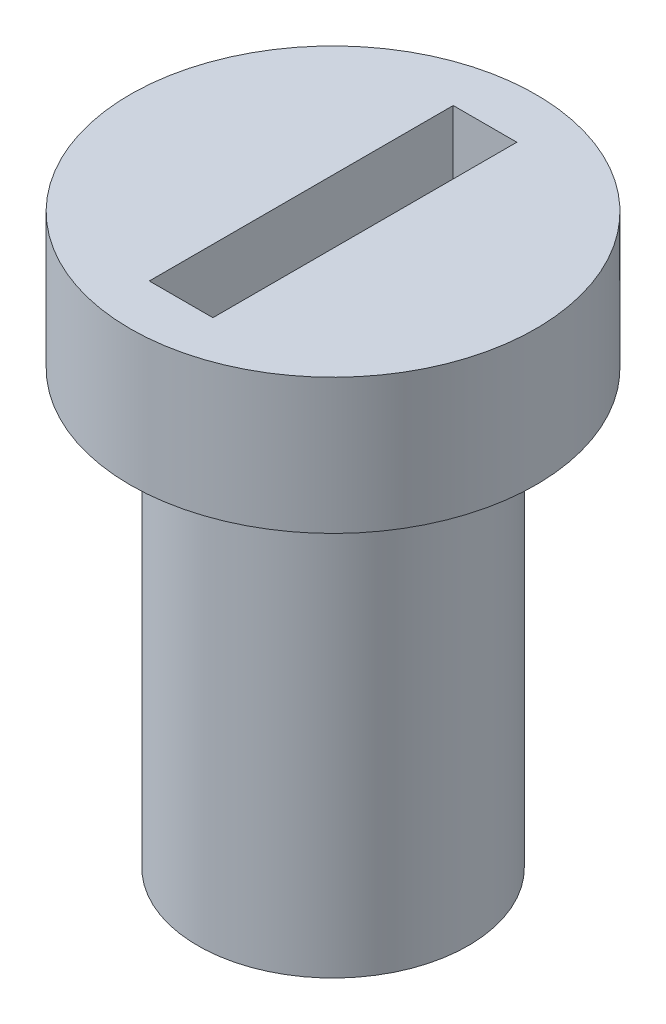
ISO-10303-21;
HEADER;
FILE_DESCRIPTION(('STEP AP214'),'2;1');
FILE_NAME('part.step','',(''),(''),'','','');
FILE_SCHEMA(('AUTOMOTIVE_DESIGN { 1 0 10303 214 1 1 1 1 }'));
ENDSEC;
DATA;
#1=APPLICATION_CONTEXT('core data for automotive mechanical design processes');
#2=APPLICATION_PROTOCOL_DEFINITION('international standard','automotive_design',2000,#1);
#3=PRODUCT_CONTEXT('',#1,'mechanical');
#4=PRODUCT('Part','Part','',(#3));
#5=PRODUCT_RELATED_PRODUCT_CATEGORY('part','',(#4));
#6=PRODUCT_DEFINITION_FORMATION('','',#4);
#7=PRODUCT_DEFINITION_CONTEXT('part definition',#1,'design');
#8=PRODUCT_DEFINITION('design','',#6,#7);
#9=PRODUCT_DEFINITION_SHAPE('','',#8);
#10=(LENGTH_UNIT() NAMED_UNIT(*) SI_UNIT(.MILLI.,.METRE.));
#11=(NAMED_UNIT(*) PLANE_ANGLE_UNIT() SI_UNIT($,.RADIAN.));
#12=(NAMED_UNIT(*) SI_UNIT($,.STERADIAN.) SOLID_ANGLE_UNIT());
#13=UNCERTAINTY_MEASURE_WITH_UNIT(LENGTH_MEASURE(1.E-05),#10,'distance_accuracy_value','');
#14=(GEOMETRIC_REPRESENTATION_CONTEXT(3) GLOBAL_UNCERTAINTY_ASSIGNED_CONTEXT((#13)) GLOBAL_UNIT_ASSIGNED_CONTEXT((#10,
#11,#12)) REPRESENTATION_CONTEXT('',''));
#15=CARTESIAN_POINT('',(0.,0.,0.));
#16=DIRECTION('',(0.,0.,1.));
#17=DIRECTION('',(1.,0.,0.));
#18=AXIS2_PLACEMENT_3D('',#15,#16,#17);
#19=CARTESIAN_POINT('',(0.,5.,0.));
#20=DIRECTION('',(0.,-1.,0.));
#21=DIRECTION('',(0.,0.,-1.));
#22=AXIS2_PLACEMENT_3D('',#19,#20,#21);
#23=CYLINDRICAL_SURFACE('',#22,7.5);
#24=CARTESIAN_POINT('',(0.,5.,0.));
#25=DIRECTION('',(0.,1.,0.));
#26=DIRECTION('',(0.,0.,1.));
#27=AXIS2_PLACEMENT_3D('',#24,#25,#26);
#28=CIRCLE('',#27,7.5);
#29=CARTESIAN_POINT('',(0.,5.,7.5));
#30=VERTEX_POINT('',#29);
#31=EDGE_CURVE('E49',#30,#30,#28,.T.);
#32=ORIENTED_EDGE('',*,*,#31,.F.);
#33=EDGE_LOOP('',(#32));
#34=FACE_BOUND('',#33,.T.);
#35=CARTESIAN_POINT('',(0.,0.,0.));
#36=DIRECTION('',(0.,1.,0.));
#37=DIRECTION('',(0.,0.,1.));
#38=AXIS2_PLACEMENT_3D('',#35,#36,#37);
#39=CIRCLE('',#38,7.5);
#40=CARTESIAN_POINT('',(0.,0.,7.5));
#41=VERTEX_POINT('',#40);
#42=EDGE_CURVE('E44',#41,#41,#39,.T.);
#43=ORIENTED_EDGE('',*,*,#42,.T.);
#44=EDGE_LOOP('',(#43));
#45=FACE_BOUND('',#44,.T.);
#46=ADVANCED_FACE('F41',(#34,#45),#23,.T.);
#47=CARTESIAN_POINT('',(0.,5.,0.));
#48=DIRECTION('',(0.,1.,0.));
#49=DIRECTION('',(0.,0.,1.));
#50=AXIS2_PLACEMENT_3D('',#47,#48,#49);
#51=PLANE('',#50);
#52=DIRECTION('',(0.,0.,1.));
#53=VECTOR('',#52,1.);
#54=CARTESIAN_POINT('',(-1.17549647003373,5.,-5.61708756250287));
#55=LINE('',#54,#53);
#56=CARTESIAN_POINT('',(-1.17549647003373,5.,-5.61708756250287));
#57=VERTEX_POINT('',#56);
#58=CARTESIAN_POINT('',(-1.17549647003373,5.,5.61708756250287));
#59=VERTEX_POINT('',#58);
#60=EDGE_CURVE('E57',#57,#59,#55,.T.);
#61=ORIENTED_EDGE('',*,*,#60,.F.);
#62=DIRECTION('',(-1.,0.,0.));
#63=VECTOR('',#62,1.);
#64=CARTESIAN_POINT('',(-1.17549647003373,5.,-5.61708756250287));
#65=LINE('',#64,#63);
#66=CARTESIAN_POINT('',(1.17549647003373,5.,-5.61708756250287));
#67=VERTEX_POINT('',#66);
#68=EDGE_CURVE('E108',#67,#57,#65,.T.);
#69=ORIENTED_EDGE('',*,*,#68,.F.);
#70=DIRECTION('',(0.,0.,-1.));
#71=VECTOR('',#70,1.);
#72=CARTESIAN_POINT('',(1.17549647003373,5.,-5.61708756250287));
#73=LINE('',#72,#71);
#74=CARTESIAN_POINT('',(1.17549647003373,5.,5.61708756250287));
#75=VERTEX_POINT('',#74);
#76=EDGE_CURVE('E114',#75,#67,#73,.T.);
#77=ORIENTED_EDGE('',*,*,#76,.F.);
#78=DIRECTION('',(1.,0.,0.));
#79=VECTOR('',#78,1.);
#80=CARTESIAN_POINT('',(-1.17549647003373,5.,5.61708756250287));
#81=LINE('',#80,#79);
#82=EDGE_CURVE('E92',#59,#75,#81,.T.);
#83=ORIENTED_EDGE('',*,*,#82,.F.);
#84=EDGE_LOOP('',(#61,#69,#77,#83));
#85=FACE_BOUND('',#84,.T.);
#86=ORIENTED_EDGE('',*,*,#31,.T.);
#87=EDGE_LOOP('',(#86));
#88=FACE_BOUND('',#87,.T.);
#89=ADVANCED_FACE('F132',(#85,#88),#51,.T.);
#90=CARTESIAN_POINT('',(0.,0.,0.));
#91=DIRECTION('',(0.,1.,0.));
#92=DIRECTION('',(0.,0.,1.));
#93=AXIS2_PLACEMENT_3D('',#90,#91,#92);
#94=PLANE('',#93);
#95=CARTESIAN_POINT('',(0.,0.,0.));
#96=DIRECTION('',(0.,-1.,0.));
#97=DIRECTION('',(0.,0.,-1.));
#98=AXIS2_PLACEMENT_3D('',#95,#96,#97);
#99=CIRCLE('',#98,5.);
#100=CARTESIAN_POINT('',(0.,0.,-5.));
#101=VERTEX_POINT('',#100);
#102=EDGE_CURVE('E11',#101,#101,#99,.T.);
#103=ORIENTED_EDGE('',*,*,#102,.F.);
#104=EDGE_LOOP('',(#103));
#105=FACE_BOUND('',#104,.T.);
#106=ORIENTED_EDGE('',*,*,#42,.F.);
#107=EDGE_LOOP('',(#106));
#108=FACE_BOUND('',#107,.T.);
#109=ADVANCED_FACE('F129',(#105,#108),#94,.F.);
#110=CARTESIAN_POINT('',(0.,-16.,0.));
#111=DIRECTION('',(0.,1.,0.));
#112=DIRECTION('',(0.,0.,1.));
#113=AXIS2_PLACEMENT_3D('',#110,#111,#112);
#114=CYLINDRICAL_SURFACE('',#113,5.);
#115=CARTESIAN_POINT('',(0.,-16.,0.));
#116=DIRECTION('',(0.,-1.,0.));
#117=DIRECTION('',(0.,0.,-1.));
#118=AXIS2_PLACEMENT_3D('',#115,#116,#117);
#119=CIRCLE('',#118,5.);
#120=CARTESIAN_POINT('',(0.,-16.,-5.));
#121=VERTEX_POINT('',#120);
#122=EDGE_CURVE('E118',#121,#121,#119,.T.);
#123=ORIENTED_EDGE('',*,*,#122,.F.);
#124=EDGE_LOOP('',(#123));
#125=FACE_BOUND('',#124,.T.);
#126=ORIENTED_EDGE('',*,*,#102,.T.);
#127=EDGE_LOOP('',(#126));
#128=FACE_BOUND('',#127,.T.);
#129=ADVANCED_FACE('F131',(#125,#128),#114,.T.);
#130=CARTESIAN_POINT('',(0.,-16.,0.));
#131=DIRECTION('',(0.,-1.,0.));
#132=DIRECTION('',(0.,0.,-1.));
#133=AXIS2_PLACEMENT_3D('',#130,#131,#132);
#134=PLANE('',#133);
#135=ORIENTED_EDGE('',*,*,#122,.T.);
#136=EDGE_LOOP('',(#135));
#137=FACE_BOUND('',#136,.T.);
#138=ADVANCED_FACE('F138',(#137),#134,.T.);
#139=CARTESIAN_POINT('',(-1.17549647003373,2.,-5.61708756250287));
#140=DIRECTION('',(-1.,0.,0.));
#141=DIRECTION('',(0.,0.,1.));
#142=AXIS2_PLACEMENT_3D('',#139,#140,#141);
#143=PLANE('',#142);
#144=ORIENTED_EDGE('',*,*,#60,.T.);
#145=DIRECTION('',(0.,1.,0.));
#146=VECTOR('',#145,1.);
#147=CARTESIAN_POINT('',(-1.17549647003373,2.,5.61708756250287));
#148=LINE('',#147,#146);
#149=CARTESIAN_POINT('',(-1.17549647003373,2.,5.61708756250287));
#150=VERTEX_POINT('',#149);
#151=EDGE_CURVE('E80',#150,#59,#148,.T.);
#152=ORIENTED_EDGE('',*,*,#151,.F.);
#153=DIRECTION('',(0.,0.,1.));
#154=VECTOR('',#153,1.);
#155=CARTESIAN_POINT('',(-1.17549647003373,2.,-5.61708756250287));
#156=LINE('',#155,#154);
#157=CARTESIAN_POINT('',(-1.17549647003373,2.,-5.61708756250287));
#158=VERTEX_POINT('',#157);
#159=EDGE_CURVE('E106',#158,#150,#156,.T.);
#160=ORIENTED_EDGE('',*,*,#159,.F.);
#161=DIRECTION('',(0.,1.,0.));
#162=VECTOR('',#161,1.);
#163=CARTESIAN_POINT('',(-1.17549647003373,2.,-5.61708756250287));
#164=LINE('',#163,#162);
#165=EDGE_CURVE('E65',#158,#57,#164,.T.);
#166=ORIENTED_EDGE('',*,*,#165,.T.);
#167=EDGE_LOOP('',(#144,#152,#160,#166));
#168=FACE_BOUND('',#167,.T.);
#169=ADVANCED_FACE('F164',(#168),#143,.F.);
#170=CARTESIAN_POINT('',(-1.17549647003373,2.,-5.61708756250287));
#171=DIRECTION('',(0.,0.,-1.));
#172=DIRECTION('',(-1.,0.,0.));
#173=AXIS2_PLACEMENT_3D('',#170,#171,#172);
#174=PLANE('',#173);
#175=ORIENTED_EDGE('',*,*,#68,.T.);
#176=ORIENTED_EDGE('',*,*,#165,.F.);
#177=DIRECTION('',(-1.,0.,0.));
#178=VECTOR('',#177,1.);
#179=CARTESIAN_POINT('',(-1.17549647003373,2.,-5.61708756250287));
#180=LINE('',#179,#178);
#181=CARTESIAN_POINT('',(1.17549647003373,2.,-5.61708756250287));
#182=VERTEX_POINT('',#181);
#183=EDGE_CURVE('E103',#182,#158,#180,.T.);
#184=ORIENTED_EDGE('',*,*,#183,.F.);
#185=DIRECTION('',(0.,1.,0.));
#186=VECTOR('',#185,1.);
#187=CARTESIAN_POINT('',(1.17549647003373,2.,-5.61708756250287));
#188=LINE('',#187,#186);
#189=EDGE_CURVE('E96',#182,#67,#188,.T.);
#190=ORIENTED_EDGE('',*,*,#189,.T.);
#191=EDGE_LOOP('',(#175,#176,#184,#190));
#192=FACE_BOUND('',#191,.T.);
#193=ADVANCED_FACE('F169',(#192),#174,.F.);
#194=CARTESIAN_POINT('',(1.17549647003373,2.,-5.61708756250287));
#195=DIRECTION('',(1.,0.,0.));
#196=DIRECTION('',(0.,0.,-1.));
#197=AXIS2_PLACEMENT_3D('',#194,#195,#196);
#198=PLANE('',#197);
#199=ORIENTED_EDGE('',*,*,#76,.T.);
#200=ORIENTED_EDGE('',*,*,#189,.F.);
#201=DIRECTION('',(0.,0.,-1.));
#202=VECTOR('',#201,1.);
#203=CARTESIAN_POINT('',(1.17549647003373,2.,-5.61708756250287));
#204=LINE('',#203,#202);
#205=CARTESIAN_POINT('',(1.17549647003373,2.,5.61708756250287));
#206=VERTEX_POINT('',#205);
#207=EDGE_CURVE('E99',#206,#182,#204,.T.);
#208=ORIENTED_EDGE('',*,*,#207,.F.);
#209=DIRECTION('',(0.,1.,0.));
#210=VECTOR('',#209,1.);
#211=CARTESIAN_POINT('',(1.17549647003373,2.,5.61708756250287));
#212=LINE('',#211,#210);
#213=EDGE_CURVE('E85',#206,#75,#212,.T.);
#214=ORIENTED_EDGE('',*,*,#213,.T.);
#215=EDGE_LOOP('',(#199,#200,#208,#214));
#216=FACE_BOUND('',#215,.T.);
#217=ADVANCED_FACE('F100',(#216),#198,.F.);
#218=CARTESIAN_POINT('',(-1.17549647003373,2.,5.61708756250287));
#219=DIRECTION('',(0.,0.,1.));
#220=DIRECTION('',(1.,0.,0.));
#221=AXIS2_PLACEMENT_3D('',#218,#219,#220);
#222=PLANE('',#221);
#223=ORIENTED_EDGE('',*,*,#82,.T.);
#224=ORIENTED_EDGE('',*,*,#213,.F.);
#225=DIRECTION('',(1.,0.,0.));
#226=VECTOR('',#225,1.);
#227=CARTESIAN_POINT('',(-1.17549647003373,2.,5.61708756250287));
#228=LINE('',#227,#226);
#229=EDGE_CURVE('E89',#150,#206,#228,.T.);
#230=ORIENTED_EDGE('',*,*,#229,.F.);
#231=ORIENTED_EDGE('',*,*,#151,.T.);
#232=EDGE_LOOP('',(#223,#224,#230,#231));
#233=FACE_BOUND('',#232,.T.);
#234=ADVANCED_FACE('F87',(#233),#222,.F.);
#235=CARTESIAN_POINT('',(0.,2.,0.));
#236=DIRECTION('',(0.,1.,0.));
#237=DIRECTION('',(0.,0.,1.));
#238=AXIS2_PLACEMENT_3D('',#235,#236,#237);
#239=PLANE('',#238);
#240=ORIENTED_EDGE('',*,*,#159,.T.);
#241=ORIENTED_EDGE('',*,*,#229,.T.);
#242=ORIENTED_EDGE('',*,*,#207,.T.);
#243=ORIENTED_EDGE('',*,*,#183,.T.);
#244=EDGE_LOOP('',(#240,#241,#242,#243));
#245=FACE_BOUND('',#244,.T.);
#246=ADVANCED_FACE('F105',(#245),#239,.T.);
#247=CLOSED_SHELL('',(#46,#89,#109,#129,#138,#169,#193,#217,#234,#246));
#248=MANIFOLD_SOLID_BREP('B2',#247);
#249=ADVANCED_BREP_SHAPE_REPRESENTATION('',(#18,#248),#14);
#250=SHAPE_DEFINITION_REPRESENTATION(#9,#249);
ENDSEC;
END-ISO-10303-21;
